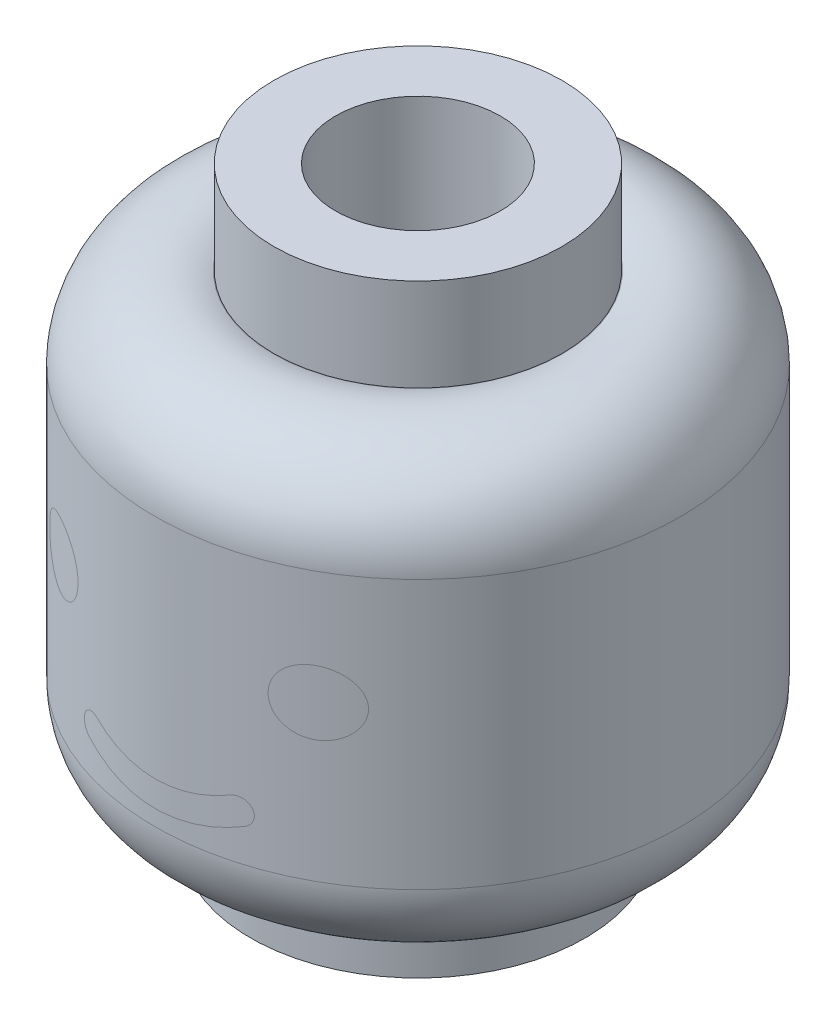
ISO-10303-21;
HEADER;
FILE_DESCRIPTION(('STEP AP214'),'2;1');
FILE_NAME('part.step','',(''),(''),'','','');
FILE_SCHEMA(('AUTOMOTIVE_DESIGN { 1 0 10303 214 1 1 1 1 }'));
ENDSEC;
DATA;
#1=APPLICATION_CONTEXT('core data for automotive mechanical design processes');
#2=APPLICATION_PROTOCOL_DEFINITION('international standard','automotive_design',2000,#1);
#3=PRODUCT_CONTEXT('',#1,'mechanical');
#4=PRODUCT('Part','Part','',(#3));
#5=PRODUCT_RELATED_PRODUCT_CATEGORY('part','',(#4));
#6=PRODUCT_DEFINITION_FORMATION('','',#4);
#7=PRODUCT_DEFINITION_CONTEXT('part definition',#1,'design');
#8=PRODUCT_DEFINITION('design','',#6,#7);
#9=PRODUCT_DEFINITION_SHAPE('','',#8);
#10=(LENGTH_UNIT() NAMED_UNIT(*) SI_UNIT(.MILLI.,.METRE.));
#11=(NAMED_UNIT(*) PLANE_ANGLE_UNIT() SI_UNIT($,.RADIAN.));
#12=(NAMED_UNIT(*) SI_UNIT($,.STERADIAN.) SOLID_ANGLE_UNIT());
#13=UNCERTAINTY_MEASURE_WITH_UNIT(LENGTH_MEASURE(1.E-05),#10,'distance_accuracy_value','');
#14=(GEOMETRIC_REPRESENTATION_CONTEXT(3) GLOBAL_UNCERTAINTY_ASSIGNED_CONTEXT((#13)) GLOBAL_UNIT_ASSIGNED_CONTEXT((#10,
#11,#12)) REPRESENTATION_CONTEXT('',''));
#15=CARTESIAN_POINT('',(0.,0.,0.));
#16=DIRECTION('',(0.,0.,1.));
#17=DIRECTION('',(1.,0.,0.));
#18=AXIS2_PLACEMENT_3D('',#15,#16,#17);
#19=CARTESIAN_POINT('',(0.,0.,0.));
#20=DIRECTION('',(0.,-1.,0.));
#21=DIRECTION('',(0.,0.,-1.));
#22=AXIS2_PLACEMENT_3D('',#19,#20,#21);
#23=CYLINDRICAL_SURFACE('',#22,5.1);
#24=CARTESIAN_POINT('',(1.29230769230769,4.25408109515948,4.93355255656635));
#25=CARTESIAN_POINT('',(1.22588861700081,4.22237068909749,4.95095914365787));
#26=CARTESIAN_POINT('',(1.15805426576758,4.1929999096417,4.96728590296533));
#27=CARTESIAN_POINT('',(1.01989445783117,4.1391801628546,4.99747898840957));
#28=CARTESIAN_POINT('',(0.949567849979218,4.11473350570831,5.01134415931557));
#29=CARTESIAN_POINT('',(0.806946973475218,4.07107180776308,5.03627524479221));
#30=CARTESIAN_POINT('',(0.734656246731726,4.05184795870389,5.04734587009735));
#31=CARTESIAN_POINT('',(0.588491034726496,4.01879837466652,5.06647048512419));
#32=CARTESIAN_POINT('',(0.514616830545434,4.00497168988103,5.07452500561787));
#33=CARTESIAN_POINT('',(0.290786918112003,3.97178825895375,5.09390065599043));
#34=CARTESIAN_POINT('',(0.139033730680463,3.9608543562066,5.10036060400772));
#35=CARTESIAN_POINT('',(-0.164334920099964,3.96213387289276,5.09960801603805));
#36=CARTESIAN_POINT('',(-0.315950389038478,3.97434630664532,5.09239606226549));
#37=CARTESIAN_POINT('',(-0.537331849244907,4.00906894357773,5.07213847664396));
#38=CARTESIAN_POINT('',(-0.609022976641743,4.02303209599416,5.064012679066));
#39=CARTESIAN_POINT('',(-0.750868622750052,4.05604320319779,5.04492865198251));
#40=CARTESIAN_POINT('',(-0.821022933784499,4.075091840679,5.03397004219623));
#41=CARTESIAN_POINT('',(-0.95943805765761,4.11809970831678,5.0094336969898));
#42=CARTESIAN_POINT('',(-1.02769609882792,4.14206573706987,4.99585233700146));
#43=CARTESIAN_POINT('',(-1.16184995911024,4.194646087782,4.96637071044));
#44=CARTESIAN_POINT('',(-1.22774673756994,4.22325849523477,4.95047139923637));
#45=CARTESIAN_POINT('',(-1.2923076923077,4.25408109515948,4.93355255656635));
#46=B_SPLINE_CURVE_WITH_KNOTS('',3,(#24,#25,#26,#27,#28,#29,#30,#31,#32,#33,#34,#35,#36,#37,#38,
#39,#40,#41,#42,#43,#44,#45),.UNSPECIFIED.,.F.,.F.,(4,2,2,2,2,2,2,2,2,2,4),(0.,
0.226855024268325,0.453816232457577,0.680392260630388,0.906928397356249,1.36128855000063,
1.81562935426994,2.03589216856599,2.2561845666244,2.4767836099487,2.697291986622),.UNSPECIFIED.);
#47=CARTESIAN_POINT('',(1.29230769230769,4.25408109515948,4.93355255656635));
#48=VERTEX_POINT('',#47);
#49=CARTESIAN_POINT('',(-1.29230769230769,4.25408109515948,4.93355255656635));
#50=VERTEX_POINT('',#49);
#51=EDGE_CURVE('E419',#48,#50,#46,.T.);
#52=ORIENTED_EDGE('',*,*,#51,.T.);
#53=CARTESIAN_POINT('',(-1.29230769230769,4.25408109515948,4.93355255656635));
#54=CARTESIAN_POINT('',(-1.30547581043881,4.26037822039603,4.93010579071235));
#55=CARTESIAN_POINT('',(-1.31915183921914,4.26547916200426,4.92646474923008));
#56=CARTESIAN_POINT('',(-1.34708624675953,4.27322759793367,4.9188983466482));
#57=CARTESIAN_POINT('',(-1.36134377179107,4.27587856278306,4.91497339625197));
#58=CARTESIAN_POINT('',(-1.39004433472992,4.27868384257217,4.90693392801757));
#59=CARTESIAN_POINT('',(-1.40448733222062,4.27883869250592,4.90281945099037));
#60=CARTESIAN_POINT('',(-1.43316537111265,4.27667269834466,4.89451320311304));
#61=CARTESIAN_POINT('',(-1.44740038106183,4.27435148366453,4.89032142078514));
#62=CARTESIAN_POINT('',(-1.47549454384824,4.26724127216415,4.88191912657831));
#63=CARTESIAN_POINT('',(-1.48934426446598,4.26241403793814,4.8777093569631));
#64=CARTESIAN_POINT('',(-1.51603731604597,4.25038813605253,4.86947903536574));
#65=CARTESIAN_POINT('',(-1.5288805409073,4.24318921879435,4.86545850335008));
#66=CARTESIAN_POINT('',(-1.55310868426944,4.22663667458158,4.85777873628787));
#67=CARTESIAN_POINT('',(-1.56450118210341,4.21729502671173,4.85411764845266));
#68=CARTESIAN_POINT('',(-1.5855404736624,4.19666669181486,4.84728624825094));
#69=CARTESIAN_POINT('',(-1.59518767499856,4.18538046014749,4.84411582131643));
#70=CARTESIAN_POINT('',(-1.61207593416043,4.16161385174445,4.83852122803878));
#71=CARTESIAN_POINT('',(-1.61939231837841,4.14919251889022,4.83607393971924));
#72=CARTESIAN_POINT('',(-1.63181270066259,4.1231777719944,4.83189719824589));
#73=CARTESIAN_POINT('',(-1.63691744863301,4.10958475711482,4.83016750178512));
#74=CARTESIAN_POINT('',(-1.64450910384696,4.08236124072317,4.8275879214484));
#75=CARTESIAN_POINT('',(-1.64711633024776,4.06876806537991,4.82669763698213));
#76=CARTESIAN_POINT('',(-1.65005099029977,4.04131055478364,4.82569520940822));
#77=CARTESIAN_POINT('',(-1.65037895663455,4.02744628364777,4.82558288448446));
#78=CARTESIAN_POINT('',(-1.64877055251492,4.00033056384696,4.82613263793194));
#79=CARTESIAN_POINT('',(-1.64690908206269,3.98707406298683,4.82676910067593));
#80=CARTESIAN_POINT('',(-1.64111461427287,3.96107806512553,4.82874228779956));
#81=CARTESIAN_POINT('',(-1.63718173609501,3.94833853843033,4.83007897189828));
#82=CARTESIAN_POINT('',(-1.62735714430615,3.92365034868767,4.83339793329887));
#83=CARTESIAN_POINT('',(-1.62145500029158,3.91170631198636,4.8353836470812));
#84=CARTESIAN_POINT('',(-1.60788974919105,3.88897672565596,4.83991130908473));
#85=CARTESIAN_POINT('',(-1.60022584652041,3.87819170265952,4.84245350858198));
#86=CARTESIAN_POINT('',(-1.5830338897801,3.8576284661279,4.84810156183211));
#87=CARTESIAN_POINT('',(-1.57344402263644,3.84790705103213,4.85122575286047));
#88=CARTESIAN_POINT('',(-1.55289999584501,3.83021069443434,4.85784078726189));
#89=CARTESIAN_POINT('',(-1.54194736011672,3.82223382913897,4.86133122041112));
#90=CARTESIAN_POINT('',(-1.52307834801866,3.81068789177738,4.86726756952062));
#91=CARTESIAN_POINT('',(-1.51547539128563,3.80656227496335,4.86964108354754));
#92=CARTESIAN_POINT('',(-1.50769230769231,3.80285003743448,4.87204925111861));
#93=B_SPLINE_CURVE_WITH_KNOTS('',3,(#53,#54,#55,#56,#57,#58,#59,#60,#61,#62,#63,#64,#65,#66,#67,
#68,#69,#70,#71,#72,#73,#74,#75,#76,#77,#78,#79,#80,#81,#82,#83,#84,#85,#86,#87,#88,#89,#90,#91,
#92),.UNSPECIFIED.,.F.,.F.,(4,2,2,2,2,2,2,2,2,2,2,2,2,2,2,2,2,2,2,4),(0.,0.0449214831244463,
0.0897792344966947,0.134627371348438,0.179482221427759,0.225042517255217,0.270607609431843,
0.31592392113096,0.361229635578571,0.404872239555663,0.448500033938543,0.489901006361838,
0.5312923026801,0.571307829525004,0.611321054689821,0.651549670089935,0.691796487962446,
0.733637428926001,0.77543199471816,0.802293138858672),.UNSPECIFIED.);
#94=CARTESIAN_POINT('',(-1.50769230769231,3.80285003743448,4.87204925111861));
#95=VERTEX_POINT('',#94);
#96=EDGE_CURVE('E11',#50,#95,#93,.T.);
#97=ORIENTED_EDGE('',*,*,#96,.T.);
#98=CARTESIAN_POINT('',(-1.50769230769231,3.80285003743448,4.87204925111861));
#99=CARTESIAN_POINT('',(-1.43370919433084,3.76752766724665,4.89495407410749));
#100=CARTESIAN_POINT('',(-1.35811386347073,3.73464407510017,4.91649100065942));
#101=CARTESIAN_POINT('',(-1.2040363960122,3.67404595251743,4.95647137250403));
#102=CARTESIAN_POINT('',(-1.12555260718714,3.6463344373561,4.97491301264523));
#103=CARTESIAN_POINT('',(-0.966045149993209,3.59638945852869,5.00833389598757));
#104=CARTESIAN_POINT('',(-0.885019083900304,3.57416135292011,5.02330975175607));
#105=CARTESIAN_POINT('',(-0.721007429883763,3.53550127383854,5.04945942252728));
#106=CARTESIAN_POINT('',(-0.638022244406144,3.51906812082097,5.06063401124969));
#107=CARTESIAN_POINT('',(-0.470341938526448,3.49217167910401,5.0789679987167));
#108=CARTESIAN_POINT('',(-0.38564180037211,3.48172975417409,5.08611302716088));
#109=CARTESIAN_POINT('',(-0.215422701344382,3.46705848094945,5.09616183980381));
#110=CARTESIAN_POINT('',(-0.129903451362183,3.46283141415117,5.09906406645278));
#111=CARTESIAN_POINT('',(0.0411401584996869,3.46066626991437,5.10054970587997));
#112=CARTESIAN_POINT('',(0.126664351466687,3.46271960021197,5.09913901919221));
#113=CARTESIAN_POINT('',(0.297167137913866,3.47305800122003,5.09205163156697));
#114=CARTESIAN_POINT('',(0.38214553075717,3.48134524455799,5.08637344333132));
#115=CARTESIAN_POINT('',(0.627524327727556,3.51436243666345,5.06381849287626));
#116=CARTESIAN_POINT('',(0.786420138809055,3.54718851571326,5.04145572327317));
#117=CARTESIAN_POINT('',(1.09567577625644,3.63351269308262,4.98339913410561));
#118=CARTESIAN_POINT('',(1.24604317690775,3.68699210821585,4.94771736399732));
#119=CARTESIAN_POINT('',(1.43015590623536,3.76670416396321,4.8955445408912));
#120=CARTESIAN_POINT('',(1.46914933543684,3.78444879185921,4.88398074723492));
#121=CARTESIAN_POINT('',(1.50769230769231,3.80285003743448,4.87204925111861));
#122=B_SPLINE_CURVE_WITH_KNOTS('',3,(#98,#99,#100,#101,#102,#103,#104,#105,#106,#107,#108,#109,
#110,#111,#112,#113,#114,#115,#116,#117,#118,#119,#120,#121),.UNSPECIFIED.,.F.,.F.,(4,2,2,2,2,2,
2,2,2,2,2,4),(0.,0.255337881999677,0.510824161884533,0.766559107420016,1.02224196881486,
1.27883097745243,1.53551415732444,1.79184632393748,2.04826786819921,2.53727993089788,
3.02585066134497,3.1589308623366),.UNSPECIFIED.);
#123=CARTESIAN_POINT('',(1.50769230769231,3.80285003743448,4.87204925111861));
#124=VERTEX_POINT('',#123);
#125=EDGE_CURVE('E57',#95,#124,#122,.T.);
#126=ORIENTED_EDGE('',*,*,#125,.T.);
#127=CARTESIAN_POINT('',(1.50769230769231,3.80285003743448,4.87204925111861));
#128=CARTESIAN_POINT('',(1.52043967292614,3.80892389207107,4.8681058314694));
#129=CARTESIAN_POINT('',(1.53269286417562,3.81610883748213,4.8642577897413));
#130=CARTESIAN_POINT('',(1.55589250859926,3.83251055230162,4.85688619617928));
#131=CARTESIAN_POINT('',(1.56683698219197,3.84173034116596,4.85336313771352));
#132=CARTESIAN_POINT('',(1.58707582301318,3.86200717943883,4.84678294474081));
#133=CARTESIAN_POINT('',(1.59636769813775,3.87306695573448,4.84372651487204));
#134=CARTESIAN_POINT('',(1.61295657674623,3.89671676085328,4.83822771457206));
#135=CARTESIAN_POINT('',(1.62025545628484,3.90930533433959,4.83578476683059));
#136=CARTESIAN_POINT('',(1.63236860273475,3.93518349165622,4.83170905341994));
#137=CARTESIAN_POINT('',(1.63726298223319,3.94843142096439,4.83005024650083));
#138=CARTESIAN_POINT('',(1.6447606581698,3.97563432824058,4.82750228114942));
#139=CARTESIAN_POINT('',(1.64736403867611,3.98958928024455,4.82661309447597));
#140=CARTESIAN_POINT('',(1.65010793974114,4.017121949213,4.8256756786411));
#141=CARTESIAN_POINT('',(1.65035529915925,4.03068787252163,4.82559096925891));
#142=CARTESIAN_POINT('',(1.64865652144264,4.0576630456147,4.82617161631263));
#143=CARTESIAN_POINT('',(1.64671082263277,4.07107232616607,4.82683682286343));
#144=CARTESIAN_POINT('',(1.64074370899042,4.09716071392666,4.82886836678685));
#145=CARTESIAN_POINT('',(1.63675224919799,4.10984750007835,4.83022458439052));
#146=CARTESIAN_POINT('',(1.62685101576418,4.13435886507319,4.83356834226028));
#147=CARTESIAN_POINT('',(1.62094102115567,4.146183344408,4.83555595524672));
#148=CARTESIAN_POINT('',(1.60722465311738,4.16896138773502,4.8401324647687));
#149=CARTESIAN_POINT('',(1.59937464601847,4.17988586344237,4.84273512540892));
#150=CARTESIAN_POINT('',(1.58210220160994,4.20027183793719,4.84840541985248));
#151=CARTESIAN_POINT('',(1.57267943112406,4.20973302591995,4.85147315216454));
#152=CARTESIAN_POINT('',(1.55204167920406,4.22740410116025,4.85811583063157));
#153=CARTESIAN_POINT('',(1.54076259669134,4.23553264856702,4.86170800342955));
#154=CARTESIAN_POINT('',(1.51708078753349,4.24978708010406,4.86914981269255));
#155=CARTESIAN_POINT('',(1.50467785384334,4.25591259425731,4.87299949656403));
#156=CARTESIAN_POINT('',(1.47850882396093,4.26625288715066,4.88100468466191));
#157=CARTESIAN_POINT('',(1.46470682808761,4.2703723350471,4.88516619984672));
#158=CARTESIAN_POINT('',(1.4365999887401,4.27618817667935,4.89350542540881));
#159=CARTESIAN_POINT('',(1.42229491773682,4.27788345919789,4.89768314233359));
#160=CARTESIAN_POINT('',(1.39329369908337,4.2788046912398,4.90601314199094));
#161=CARTESIAN_POINT('',(1.37859536944953,4.27798177578482,4.91016333509879));
#162=CARTESIAN_POINT('',(1.34952943734206,4.2737563481854,4.91823099172259));
#163=CARTESIAN_POINT('',(1.33516133924489,4.27035800273855,4.92214882014501));
#164=CARTESIAN_POINT('',(1.31133726767922,4.26244677526675,4.92853951469861));
#165=CARTESIAN_POINT('',(1.30169035471946,4.25856516454122,4.93109580905959));
#166=CARTESIAN_POINT('',(1.29230769230769,4.25408109515948,4.93355255656635));
#167=B_SPLINE_CURVE_WITH_KNOTS('',3,(#127,#128,#129,#130,#131,#132,#133,#134,#135,#136,#137,
#138,#139,#140,#141,#142,#143,#144,#145,#146,#147,#148,#149,#150,#151,#152,#153,#154,#155,#156,
#157,#158,#159,#160,#161,#162,#163,#164,#165,#166),.UNSPECIFIED.,.F.,.F.,(4,2,2,2,2,2,2,2,2,2,2,
2,2,2,2,2,2,2,2,4),(0.,0.04394169445748,0.0879490366681004,0.132022189043521,0.176053710146528,
0.21849726659161,0.260939265506971,0.301446942698854,0.341946525088201,0.381869349720327,
0.42179677409338,0.462720337939842,0.503652582116524,0.546539685540569,0.589434706102915,
0.634206586345367,0.67899898307402,0.724666039085702,0.770259369283766,0.802304361634527),.UNSPECIFIED.);
#168=EDGE_CURVE('E425',#124,#48,#167,.T.);
#169=ORIENTED_EDGE('',*,*,#168,.T.);
#170=EDGE_LOOP('',(#52,#97,#126,#169));
#171=FACE_BOUND('',#170,.T.);
#172=ADVANCED_FACE('F42',(#171),#23,.T.);
#173=CARTESIAN_POINT('',(3.095,6.16146744150947,4.0535139077102));
#174=CARTESIAN_POINT('',(3.09499860193585,6.19172799450688,4.05351520990944));
#175=CARTESIAN_POINT('',(3.09278766178486,6.22199988996722,4.05520602983803));
#176=CARTESIAN_POINT('',(3.08409267226761,6.28156456534221,4.0618223283753));
#177=CARTESIAN_POINT('',(3.07760525295517,6.31085655392842,4.06675035795551));
#178=CARTESIAN_POINT('',(3.06080334550029,6.36748914449043,4.07941069466848));
#179=CARTESIAN_POINT('',(3.05050880681332,6.39483904800461,4.08712837921838));
#180=CARTESIAN_POINT('',(3.02659584988562,6.44722298734285,4.10486765296008));
#181=CARTESIAN_POINT('',(3.01297657074637,6.47225642102801,4.11488983883357));
#182=CARTESIAN_POINT('',(2.98163294767719,6.5217258246024,4.13766486035557));
#183=CARTESIAN_POINT('',(2.96365703173191,6.54592730015925,4.15057798734039));
#184=CARTESIAN_POINT('',(2.92495832811053,6.59102779149593,4.17793983665437));
#185=CARTESIAN_POINT('',(2.9042342616573,6.61192525986055,4.19238927323921));
#186=CARTESIAN_POINT('',(2.85620082544248,6.65409979122303,4.22529532660076));
#187=CARTESIAN_POINT('',(2.82839881449989,6.67463872406835,4.24398018116912));
#188=CARTESIAN_POINT('',(2.77022658703614,6.71070501737419,4.28217918969877));
#189=CARTESIAN_POINT('',(2.739854509567,6.72622870649971,4.30169393940038));
#190=CARTESIAN_POINT('',(2.67243169046927,6.75406153257456,4.34395165708201));
#191=CARTESIAN_POINT('',(2.63506267930364,6.76553869173234,4.3667396050707));
#192=CARTESIAN_POINT('',(2.55862354696581,6.78138283301316,4.41196322532));
#193=CARTESIAN_POINT('',(2.51955276207472,6.7857470150001,4.43439875540534));
#194=CARTESIAN_POINT('',(2.4392707814489,6.78704692905129,4.47907820666036));
#195=CARTESIAN_POINT('',(2.3980335025884,6.78370581943564,4.50128527055906));
#196=CARTESIAN_POINT('',(2.31616559816084,6.76866550209722,4.54395252845122));
#197=CARTESIAN_POINT('',(2.27553473276848,6.75696969300245,4.564413428983));
#198=CARTESIAN_POINT('',(2.19940954765823,6.72623792076884,4.60154988307877));
#199=CARTESIAN_POINT('',(2.16375676573105,6.70779993076919,4.61839271449916));
#200=CARTESIAN_POINT('',(2.09592297204455,6.66378377215512,4.6495697657722));
#201=CARTESIAN_POINT('',(2.06373906836366,6.63821161596357,4.66390608154946));
#202=CARTESIAN_POINT('',(2.00782280643255,6.58379872883863,4.68822715267566));
#203=CARTESIAN_POINT('',(1.98354629633834,6.55565452025639,4.6985206527866));
#204=CARTESIAN_POINT('',(1.94010086196038,6.49496635574877,4.71662634450064));
#205=CARTESIAN_POINT('',(1.9209288069266,6.46242511523586,4.72444005761565));
#206=CARTESIAN_POINT('',(1.89009195435159,6.39708899556223,4.73685599133932));
#207=CARTESIAN_POINT('',(1.87790556056775,6.36458239684479,4.74168450559473));
#208=CARTESIAN_POINT('',(1.85905654473972,6.29776348306021,4.74910651657552));
#209=CARTESIAN_POINT('',(1.85239206114323,6.26345178068347,4.75170076653013));
#210=CARTESIAN_POINT('',(1.84506116193845,6.19579265069876,4.75455189833201));
#211=CARTESIAN_POINT('',(1.84411930354593,6.16247925962172,4.75491612322934));
#212=CARTESIAN_POINT('',(1.8475348885831,6.09616920119354,4.75359003329659));
#213=CARTESIAN_POINT('',(1.8518916575595,6.06317249407103,4.75189997995212));
#214=CARTESIAN_POINT('',(1.86564259871342,5.99884542527523,4.74651773484516));
#215=CARTESIAN_POINT('',(1.87497451161927,5.96749961958088,4.74285028209161));
#216=CARTESIAN_POINT('',(1.89827394433829,5.90689225046587,4.73357288763884));
#217=CARTESIAN_POINT('',(1.9122416015323,5.87763074884502,4.7279628883718));
#218=CARTESIAN_POINT('',(1.94459925360048,5.82139176737223,4.7147474575013));
#219=CARTESIAN_POINT('',(1.96306837257127,5.79446837131119,4.70710607285697));
#220=CARTESIAN_POINT('',(2.00360948770874,5.7441553409494,4.68999277485843));
#221=CARTESIAN_POINT('',(2.02568209851579,5.72076631081119,4.68052054917055));
#222=CARTESIAN_POINT('',(2.07388815582137,5.67686838639518,4.65936838278014));
#223=CARTESIAN_POINT('',(2.10017090727434,5.65656609221363,4.64760075102104));
#224=CARTESIAN_POINT('',(2.15503335901651,5.62063708341674,4.62241740714542));
#225=CARTESIAN_POINT('',(2.18361376667129,5.60501181573625,4.60900118681087));
#226=CARTESIAN_POINT('',(2.24467717791531,5.57745786741589,4.57959207992872));
#227=CARTESIAN_POINT('',(2.27728747840728,5.56594159319007,4.56347787002957));
#228=CARTESIAN_POINT('',(2.3433079341888,5.54848978927312,4.52993172346121));
#229=CARTESIAN_POINT('',(2.37671842702197,5.54255665879281,4.51249922376442));
#230=CARTESIAN_POINT('',(2.44701857025755,5.5357919294469,4.47480161963922));
#231=CARTESIAN_POINT('',(2.48390866670006,5.53555509630338,4.45443047845522));
#232=CARTESIAN_POINT('',(2.55678538677833,5.54144210411704,4.41300452057061));
#233=CARTESIAN_POINT('',(2.59277162760133,5.54756859513224,4.39194942256952));
#234=CARTESIAN_POINT('',(2.6662715936861,5.56676280365719,4.34775754752757));
#235=CARTESIAN_POINT('',(2.70362575043334,5.58041209711564,4.32460589287634));
#236=CARTESIAN_POINT('',(2.77542179929066,5.61472504631483,4.27888397771699));
#237=CARTESIAN_POINT('',(2.80986077083904,5.63539563478928,4.25631431564991));
#238=CARTESIAN_POINT('',(2.87521235954335,5.68386282949409,4.21244850739158));
#239=CARTESIAN_POINT('',(2.90607217390348,5.7117502745022,4.19117321133667));
#240=CARTESIAN_POINT('',(2.96238699485579,5.77424756742899,4.15155937417582));
#241=CARTESIAN_POINT('',(2.98785473518364,5.80884119926362,4.13321393978616));
#242=CARTESIAN_POINT('',(3.02464224828533,5.87187274649563,4.10632208099495));
#243=CARTESIAN_POINT('',(3.03787229533079,5.89867246949772,4.0965267546273));
#244=CARTESIAN_POINT('',(3.0605420992893,5.95460711097047,4.0796179282492));
#245=CARTESIAN_POINT('',(3.06998826793891,5.98373797796078,4.07249989286133));
#246=CARTESIAN_POINT('',(3.08309706894776,6.03759779307777,4.06258118535075));
#247=CARTESIAN_POINT('',(3.08754141143147,6.06203145638561,4.05919967300131));
#248=CARTESIAN_POINT('',(3.09349349891351,6.11146330051295,4.05466546251341));
#249=CARTESIAN_POINT('',(3.09500115529656,6.13646149834441,4.05351283163204));
#250=CARTESIAN_POINT('',(3.095,6.16146744150947,4.0535139077102));
#251=B_SPLINE_CURVE_WITH_KNOTS('',3,(#173,#174,#175,#176,#177,#178,#179,#180,#181,#182,#183,
#184,#185,#186,#187,#188,#189,#190,#191,#192,#193,#194,#195,#196,#197,#198,#199,#200,#201,#202,
#203,#204,#205,#206,#207,#208,#209,#210,#211,#212,#213,#214,#215,#216,#217,#218,#219,#220,#221,
#222,#223,#224,#225,#226,#227,#228,#229,#230,#231,#232,#233,#234,#235,#236,#237,#238,#239,#240,
#241,#242,#243,#244,#245,#246,#247,#248,#249,#250),.UNSPECIFIED.,.T.,.F.,(4,2,2,2,2,2,2,2,2,2,2,
2,2,2,2,2,2,2,2,2,2,2,2,2,2,2,2,2,2,2,2,2,2,2,2,2,2,2,4),(0.,0.0906787627947074,
0.181429067721731,0.271710424098317,0.36201518250626,0.460048594000146,0.558127783807477,
0.675552291108697,0.793062563530542,0.928207018511045,1.0634046624073,1.20353508450097,
1.34360853504654,1.47345948899792,1.60320133803533,1.7182731462541,1.83327421325887,
1.9378900710966,2.04247064635766,2.14197490073356,2.241466490707,2.33974129513164,
2.43801901220197,2.53816759256269,2.63833327294725,2.74358604597446,2.84887134754808,
2.96286094284713,3.07689949987094,3.20279867331579,3.32875029952491,3.4661777460219,
3.60374128291714,3.74312854094349,3.88218286175426,3.97617380616965,4.0700048034043,
4.14493534315316,4.21986814391581),.UNSPECIFIED.);
#252=CARTESIAN_POINT('',(3.095,6.16146744150947,4.0535139077102));
#253=VERTEX_POINT('',#252);
#254=EDGE_CURVE('E286',#253,#253,#251,.T.);
#255=ORIENTED_EDGE('',*,*,#254,.T.);
#256=EDGE_LOOP('',(#255));
#257=FACE_BOUND('',#256,.T.);
#258=ADVANCED_FACE('F365',(#257),#23,.T.);
#259=CARTESIAN_POINT('',(-1.845,6.16146744150947,4.75457411341962));
#260=CARTESIAN_POINT('',(-1.84499920350535,6.19469052715655,4.75457430406465));
#261=CARTESIAN_POINT('',(-1.84765745197126,6.22790833654837,4.7535454255577));
#262=CARTESIAN_POINT('',(-1.85817944941604,6.29337332910446,4.74944215005716));
#263=CARTESIAN_POINT('',(-1.86604227741473,6.3256206829411,4.74636811496525));
#264=CARTESIAN_POINT('',(-1.88664902018034,6.3882081059728,4.7382145341163));
#265=CARTESIAN_POINT('',(-1.89938834187857,6.4185499387294,4.7331368753926));
#266=CARTESIAN_POINT('',(-1.92925604716883,6.47656385517422,4.72104115046017));
#267=CARTESIAN_POINT('',(-1.94638479583096,6.50423571653641,4.71402292284984));
#268=CARTESIAN_POINT('',(-1.98480643471912,6.55680846086866,4.69797663281727));
#269=CARTESIAN_POINT('',(-2.00617959699848,6.581638516849,4.68890927025737));
#270=CARTESIAN_POINT('',(-2.05209341399138,6.62733108173221,4.66899755599778));
#271=CARTESIAN_POINT('',(-2.07663468338846,6.64819281874457,4.65815285934522));
#272=CARTESIAN_POINT('',(-2.12971385871981,6.68679911352754,4.63413613951042));
#273=CARTESIAN_POINT('',(-2.15840568668008,6.70426737753367,4.62086102409777));
#274=CARTESIAN_POINT('',(-2.21757981665435,6.73418875070092,4.59275666253795));
#275=CARTESIAN_POINT('',(-2.24806277153514,6.74664001800654,4.57792684813813));
#276=CARTESIAN_POINT('',(-2.31285861824305,6.7674322923299,4.54555965109184));
#277=CARTESIAN_POINT('',(-2.34726529958598,6.77528777316398,4.5278986997305));
#278=CARTESIAN_POINT('',(-2.4163055058728,6.78513357061616,4.49143570938817));
#279=CARTESIAN_POINT('',(-2.45093911465559,6.78712158091,4.47263322466797));
#280=CARTESIAN_POINT('',(-2.52325916921179,6.78535058613148,4.43227373534371));
#281=CARTESIAN_POINT('',(-2.56088490612101,6.78096707298784,4.41063463996238));
#282=CARTESIAN_POINT('',(-2.63457975318231,6.76558450257911,4.36701578478511));
#283=CARTESIAN_POINT('',(-2.67064760647881,6.75458020689292,4.34503576867941));
#284=CARTESIAN_POINT('',(-2.74295186748084,6.7251654613148,4.29978635465344));
#285=CARTESIAN_POINT('',(-2.77900785672802,6.70627241598778,4.27654015828697));
#286=CARTESIAN_POINT('',(-2.84733166068423,6.66138160164918,4.23135638780459));
#287=CARTESIAN_POINT('',(-2.87960210218252,6.63538880134026,4.20941791152427));
#288=CARTESIAN_POINT('',(-2.93268717134774,6.58291921234826,4.17254799257693));
#289=CARTESIAN_POINT('',(-2.95446987197282,6.55776331711742,4.15712735978474));
#290=CARTESIAN_POINT('',(-2.99421695880275,6.50344718261535,4.12859077400189));
#291=CARTESIAN_POINT('',(-3.01218660388553,6.47429255094653,4.11547165120855));
#292=CARTESIAN_POINT('',(-3.0409034903585,6.41746763850714,4.09428532299961));
#293=CARTESIAN_POINT('',(-3.05235046496813,6.39032953004754,4.08574326423624));
#294=CARTESIAN_POINT('',(-3.07143318348613,6.33404809569067,4.07141762829974));
#295=CARTESIAN_POINT('',(-3.07907113905306,6.30490594462774,4.06563245046557));
#296=CARTESIAN_POINT('',(-3.09010947772414,6.24521834624068,4.05724946012816));
#297=CARTESIAN_POINT('',(-3.09348879207714,6.21466669106443,4.05466749583518));
#298=CARTESIAN_POINT('',(-3.09569963467274,6.15330456464067,4.05297992234742));
#299=CARTESIAN_POINT('',(-3.09453227476647,6.12249415850727,4.05387346324686));
#300=CARTESIAN_POINT('',(-3.08802567175795,6.06422028012998,4.05883124428674));
#301=CARTESIAN_POINT('',(-3.08304283395885,6.03669212132631,4.06262456648456));
#302=CARTESIAN_POINT('',(-3.06961591270729,5.98299572657177,4.07277894827268));
#303=CARTESIAN_POINT('',(-3.06117119267949,5.95682774172915,4.07914048010538));
#304=CARTESIAN_POINT('',(-3.04069350634257,5.90505133087674,4.09442957878904));
#305=CARTESIAN_POINT('',(-3.02849675209748,5.87954280090619,4.10347340152777));
#306=CARTESIAN_POINT('',(-3.00119582895741,5.83096242921478,4.12348274141375));
#307=CARTESIAN_POINT('',(-2.98609033819963,5.807891702754,4.13444913206001));
#308=CARTESIAN_POINT('',(-2.95070954185588,5.76078173279986,4.15979090755149));
#309=CARTESIAN_POINT('',(-2.92999230215707,5.73721709790755,4.17443000782861));
#310=CARTESIAN_POINT('',(-2.88582877191806,5.69384478519461,4.20508222358603));
#311=CARTESIAN_POINT('',(-2.86238068216117,5.67403960714016,4.22109624308335));
#312=CARTESIAN_POINT('',(-2.80858923836408,5.63488537036958,4.25711881931157));
#313=CARTESIAN_POINT('',(-2.77778215172349,5.61633751153106,4.2773083445416));
#314=CARTESIAN_POINT('',(-2.71374426873498,5.58484935647124,4.31822174831926));
#315=CARTESIAN_POINT('',(-2.68051192130769,5.57191268626893,4.33894596325404));
#316=CARTESIAN_POINT('',(-2.60813242880629,5.55061989010153,4.38288088828667));
#317=CARTESIAN_POINT('',(-2.56875826416209,5.54301498289659,4.40608654373895));
#318=CARTESIAN_POINT('',(-2.48882428826254,5.53546245065263,4.45172688427581));
#319=CARTESIAN_POINT('',(-2.44826422911635,5.5355164381814,4.47416140600486));
#320=CARTESIAN_POINT('',(-2.36715265082265,5.54364232100314,4.51759928211651));
#321=CARTESIAN_POINT('',(-2.32660113155463,5.551714094338,4.53860265826299));
#322=CARTESIAN_POINT('',(-2.24698327012814,5.57613099548558,4.57854194541311));
#323=CARTESIAN_POINT('',(-2.20791601521389,5.59247094721686,4.59747914089103));
#324=CARTESIAN_POINT('',(-2.13649451888951,5.63146949664629,4.63106954949723));
#325=CARTESIAN_POINT('',(-2.10385383669216,5.65339952972906,4.64595735309994));
#326=CARTESIAN_POINT('',(-2.04268538693218,5.70365751294205,4.67317417679004));
#327=CARTESIAN_POINT('',(-2.01415420983071,5.7319801086717,4.6855053218409));
#328=CARTESIAN_POINT('',(-1.96552275174193,5.79076766008387,4.70609624318402));
#329=CARTESIAN_POINT('',(-1.94483793675522,5.82064489586054,4.71465616030132));
#330=CARTESIAN_POINT('',(-1.90878827661837,5.88399232653877,4.72936655302359));
#331=CARTESIAN_POINT('',(-1.89342141667525,5.91746115439777,4.73551794125487));
#332=CARTESIAN_POINT('',(-1.86923845718362,5.98550664312903,4.74511446619856));
#333=CARTESIAN_POINT('',(-1.86018381238167,6.01998465488506,4.74865846920509));
#334=CARTESIAN_POINT('',(-1.84806584661198,6.09013317517936,4.75338786164922));
#335=CARTESIAN_POINT('',(-1.84500085501568,6.12580334837702,4.75457390876729));
#336=CARTESIAN_POINT('',(-1.845,6.16146744150947,4.75457411341962));
#337=B_SPLINE_CURVE_WITH_KNOTS('',3,(#259,#260,#261,#262,#263,#264,#265,#266,#267,#268,#269,
#270,#271,#272,#273,#274,#275,#276,#277,#278,#279,#280,#281,#282,#283,#284,#285,#286,#287,#288,
#289,#290,#291,#292,#293,#294,#295,#296,#297,#298,#299,#300,#301,#302,#303,#304,#305,#306,#307,
#308,#309,#310,#311,#312,#313,#314,#315,#316,#317,#318,#319,#320,#321,#322,#323,#324,#325,#326,
#327,#328,#329,#330,#331,#332,#333,#334,#335,#336),.UNSPECIFIED.,.T.,.F.,(4,2,2,2,2,2,2,2,2,2,2,
2,2,2,2,2,2,2,2,2,2,2,2,2,2,2,2,2,2,2,2,2,2,2,2,2,2,2,4),(0.,0.0995396134183582,
0.199061617438708,0.298490113473083,0.397926881693869,0.499462764286354,0.601018376800005,
0.708920840821429,0.816862882318314,0.934769207151073,1.05272187120697,1.18304336994216,
1.3134681160352,1.45342709615701,1.59328837704528,1.70289628355717,1.81235202446057,
1.9039731398253,1.9955409944317,2.08756010614522,2.17955671676834,2.26387342363708,
2.34820564172932,2.43692418242666,2.52568313644157,2.62917137321433,2.73272818294955,
2.85595521069489,2.97926175104852,3.11760918654601,3.25598575091373,3.39436021047522,
3.53264815122218,3.65808113191996,3.78340943749031,3.89481210487365,4.00617251923513,
4.11305544572557,4.21990855627139),.UNSPECIFIED.);
#338=CARTESIAN_POINT('',(-1.845,6.16146744150947,4.75457411341962));
#339=VERTEX_POINT('',#338);
#340=EDGE_CURVE('E278',#339,#339,#337,.T.);
#341=ORIENTED_EDGE('',*,*,#340,.T.);
#342=EDGE_LOOP('',(#341));
#343=FACE_BOUND('',#342,.T.);
#344=ADVANCED_FACE('F303',(#343),#23,.T.);
#345=CARTESIAN_POINT('',(0.,9.76146744150947,0.));
#346=DIRECTION('',(0.,1.,0.));
#347=DIRECTION('',(0.,0.,1.));
#348=AXIS2_PLACEMENT_3D('',#345,#346,#347);
#349=PLANE('',#348);
#350=DIRECTION('',(0.866025403784436,0.,-0.500000000000004));
#351=VECTOR('',#350,1.);
#352=CARTESIAN_POINT('',(0.210000000000002,9.76146744150947,0.363730669589463));
#353=LINE('',#352,#351);
#354=CARTESIAN_POINT('',(-1.12704898937922,9.76146744150947,1.13567626352728));
#355=VERTEX_POINT('',#354);
#356=CARTESIAN_POINT('',(0.,9.76146744150947,0.484974226119286));
#357=VERTEX_POINT('',#356);
#358=EDGE_CURVE('E130',#355,#357,#353,.T.);
#359=ORIENTED_EDGE('',*,*,#358,.T.);
#360=DIRECTION('',(0.86602540378444,0.,0.499999999999998));
#361=VECTOR('',#360,1.);
#362=CARTESIAN_POINT('',(-0.209999999999999,9.76146744150947,0.363730669589465));
#363=LINE('',#362,#361);
#364=CARTESIAN_POINT('',(1.12704898937923,9.76146744150947,1.13567626352727));
#365=VERTEX_POINT('',#364);
#366=EDGE_CURVE('E140',#357,#365,#363,.T.);
#367=ORIENTED_EDGE('',*,*,#366,.T.);
#368=CARTESIAN_POINT('',(0.,9.76146744150947,0.));
#369=DIRECTION('',(0.,-1.,0.));
#370=DIRECTION('',(0.,0.,-1.));
#371=AXIS2_PLACEMENT_3D('',#368,#369,#370);
#372=CIRCLE('',#371,1.6);
#373=CARTESIAN_POINT('',(1.54704898937923,9.76146744150947,0.408214924348333));
#374=VERTEX_POINT('',#373);
#375=EDGE_CURVE('E258',#374,#365,#372,.T.);
#376=ORIENTED_EDGE('',*,*,#375,.F.);
#377=DIRECTION('',(-0.866025403784443,0.,-0.499999999999992));
#378=VECTOR('',#377,1.);
#379=CARTESIAN_POINT('',(0.209999999999997,9.76146744150947,-0.363730669589466));
#380=LINE('',#379,#378);
#381=CARTESIAN_POINT('',(0.419999999999998,9.76146744150947,-0.242487113059646));
#382=VERTEX_POINT('',#381);
#383=EDGE_CURVE('E166',#374,#382,#380,.T.);
#384=ORIENTED_EDGE('',*,*,#383,.T.);
#385=DIRECTION('',(0.,0.,-1.));
#386=VECTOR('',#385,1.);
#387=CARTESIAN_POINT('',(0.42,9.76146744150947,0.));
#388=LINE('',#387,#386);
#389=CARTESIAN_POINT('',(0.419999999999989,9.76146744150947,-1.54389118787563));
#390=VERTEX_POINT('',#389);
#391=EDGE_CURVE('E162',#382,#390,#388,.T.);
#392=ORIENTED_EDGE('',*,*,#391,.T.);
#393=CARTESIAN_POINT('',(-0.42,9.76146744150947,-1.54389118787562));
#394=VERTEX_POINT('',#393);
#395=EDGE_CURVE('E253',#394,#390,#372,.T.);
#396=ORIENTED_EDGE('',*,*,#395,.F.);
#397=DIRECTION('',(0.,0.,1.));
#398=VECTOR('',#397,1.);
#399=CARTESIAN_POINT('',(-0.42,9.76146744150947,0.));
#400=LINE('',#399,#398);
#401=CARTESIAN_POINT('',(-0.42,9.76146744150947,-0.242487113059643));
#402=VERTEX_POINT('',#401);
#403=EDGE_CURVE('E194',#394,#402,#400,.T.);
#404=ORIENTED_EDGE('',*,*,#403,.T.);
#405=DIRECTION('',(-0.86602540378444,0.,0.499999999999998));
#406=VECTOR('',#405,1.);
#407=CARTESIAN_POINT('',(-0.209999999999999,9.76146744150947,-0.363730669589465));
#408=LINE('',#407,#406);
#409=CARTESIAN_POINT('',(-1.54704898937922,9.76146744150947,0.408214924348343));
#410=VERTEX_POINT('',#409);
#411=EDGE_CURVE('E191',#402,#410,#408,.T.);
#412=ORIENTED_EDGE('',*,*,#411,.T.);
#413=EDGE_CURVE('E153',#355,#410,#372,.T.);
#414=ORIENTED_EDGE('',*,*,#413,.F.);
#415=EDGE_LOOP('',(#359,#367,#376,#384,#392,#396,#404,#412,#414));
#416=FACE_BOUND('',#415,.T.);
#417=ADVANCED_FACE('F151',(#416),#349,.T.);
#418=CARTESIAN_POINT('',(2.45,8.86146744150947,0.));
#419=DIRECTION('',(0.,-1.,0.));
#420=DIRECTION('',(0.,0.,-1.));
#421=AXIS2_PLACEMENT_3D('',#418,#419,#420);
#422=PLANE('',#421);
#423=CARTESIAN_POINT('',(0.,8.86146744150947,0.));
#424=DIRECTION('',(0.,-1.,0.));
#425=DIRECTION('',(0.,0.,-1.));
#426=AXIS2_PLACEMENT_3D('',#423,#424,#425);
#427=CIRCLE('',#426,2.45);
#428=CARTESIAN_POINT('',(0.,8.86146744150947,-2.45));
#429=VERTEX_POINT('',#428);
#430=EDGE_CURVE('E203',#429,#429,#427,.T.);
#431=ORIENTED_EDGE('',*,*,#430,.T.);
#432=EDGE_LOOP('',(#431));
#433=FACE_BOUND('',#432,.T.);
#434=CARTESIAN_POINT('',(0.,8.86146744150947,0.));
#435=DIRECTION('',(0.,-1.,0.));
#436=DIRECTION('',(0.,0.,-1.));
#437=AXIS2_PLACEMENT_3D('',#434,#435,#436);
#438=CIRCLE('',#437,1.6);
#439=CARTESIAN_POINT('',(-1.54704898937922,8.86146744150947,0.408214924348343));
#440=VERTEX_POINT('',#439);
#441=CARTESIAN_POINT('',(-0.42,8.86146744150947,-1.54389118787562));
#442=VERTEX_POINT('',#441);
#443=EDGE_CURVE('E262',#440,#442,#438,.T.);
#444=ORIENTED_EDGE('',*,*,#443,.F.);
#445=DIRECTION('',(0.86602540378444,0.,-0.499999999999998));
#446=VECTOR('',#445,1.);
#447=CARTESIAN_POINT('',(1.62750000000001,8.86146744150947,-1.4246117892254));
#448=LINE('',#447,#446);
#449=CARTESIAN_POINT('',(-0.42,8.86146744150947,-0.242487113059643));
#450=VERTEX_POINT('',#449);
#451=EDGE_CURVE('E266',#440,#450,#448,.T.);
#452=ORIENTED_EDGE('',*,*,#451,.T.);
#453=DIRECTION('',(0.,0.,-1.));
#454=VECTOR('',#453,1.);
#455=CARTESIAN_POINT('',(-0.42,8.86146744150947,0.));
#456=LINE('',#455,#454);
#457=EDGE_CURVE('E257',#450,#442,#456,.T.);
#458=ORIENTED_EDGE('',*,*,#457,.T.);
#459=EDGE_LOOP('',(#444,#452,#458));
#460=FACE_BOUND('',#459,.T.);
#461=CARTESIAN_POINT('',(0.,8.86146744150947,0.));
#462=DIRECTION('',(0.,-1.,0.));
#463=DIRECTION('',(0.,0.,-1.));
#464=AXIS2_PLACEMENT_3D('',#461,#462,#463);
#465=CIRCLE('',#464,1.6);
#466=CARTESIAN_POINT('',(0.419999999999989,8.86146744150947,-1.54389118787563));
#467=VERTEX_POINT('',#466);
#468=CARTESIAN_POINT('',(1.54704898937923,8.86146744150947,0.408214924348332));
#469=VERTEX_POINT('',#468);
#470=EDGE_CURVE('E270',#467,#469,#465,.T.);
#471=ORIENTED_EDGE('',*,*,#470,.F.);
#472=DIRECTION('',(0.,0.,1.));
#473=VECTOR('',#472,1.);
#474=CARTESIAN_POINT('',(0.42,8.86146744150947,0.));
#475=LINE('',#474,#473);
#476=CARTESIAN_POINT('',(0.419999999999998,8.86146744150947,-0.242487113059646));
#477=VERTEX_POINT('',#476);
#478=EDGE_CURVE('E182',#467,#477,#475,.T.);
#479=ORIENTED_EDGE('',*,*,#478,.T.);
#480=DIRECTION('',(0.866025403784443,0.,0.499999999999992));
#481=VECTOR('',#480,1.);
#482=CARTESIAN_POINT('',(2.04750000000002,8.86146744150947,0.69715045004646));
#483=LINE('',#482,#481);
#484=EDGE_CURVE('E159',#477,#469,#483,.T.);
#485=ORIENTED_EDGE('',*,*,#484,.T.);
#486=EDGE_LOOP('',(#471,#479,#485));
#487=FACE_BOUND('',#486,.T.);
#488=CARTESIAN_POINT('',(0.,8.86146744150947,0.));
#489=DIRECTION('',(0.,-1.,0.));
#490=DIRECTION('',(0.,0.,-1.));
#491=AXIS2_PLACEMENT_3D('',#488,#489,#490);
#492=CIRCLE('',#491,1.6);
#493=CARTESIAN_POINT('',(1.12704898937923,8.86146744150947,1.13567626352727));
#494=VERTEX_POINT('',#493);
#495=CARTESIAN_POINT('',(-1.12704898937922,8.86146744150947,1.13567626352728));
#496=VERTEX_POINT('',#495);
#497=EDGE_CURVE('E274',#494,#496,#492,.T.);
#498=ORIENTED_EDGE('',*,*,#497,.F.);
#499=DIRECTION('',(-0.86602540378444,0.,-0.499999999999998));
#500=VECTOR('',#499,1.);
#501=CARTESIAN_POINT('',(1.62750000000001,8.86146744150947,1.4246117892254));
#502=LINE('',#501,#500);
#503=CARTESIAN_POINT('',(0.,8.86146744150947,0.484974226119286));
#504=VERTEX_POINT('',#503);
#505=EDGE_CURVE('E188',#494,#504,#502,.T.);
#506=ORIENTED_EDGE('',*,*,#505,.T.);
#507=DIRECTION('',(-0.866025403784436,0.,0.500000000000004));
#508=VECTOR('',#507,1.);
#509=CARTESIAN_POINT('',(2.04749999999999,8.86146744150947,-0.69715045004648));
#510=LINE('',#509,#508);
#511=EDGE_CURVE('E133',#504,#496,#510,.T.);
#512=ORIENTED_EDGE('',*,*,#511,.T.);
#513=EDGE_LOOP('',(#498,#506,#512));
#514=FACE_BOUND('',#513,.T.);
#515=ADVANCED_FACE('F296',(#433,#460,#487,#514),#422,.T.);
#516=CARTESIAN_POINT('',(0.,0.,0.));
#517=DIRECTION('',(0.,-1.,0.));
#518=DIRECTION('',(0.,0.,-1.));
#519=AXIS2_PLACEMENT_3D('',#516,#517,#518);
#520=CYLINDRICAL_SURFACE('',#519,1.6);
#521=ORIENTED_EDGE('',*,*,#395,.T.);
#522=DIRECTION('',(0.,1.,0.));
#523=VECTOR('',#522,1.);
#524=CARTESIAN_POINT('',(0.419999999999989,-0.238532558490531,-1.54389118787563));
#525=LINE('',#524,#523);
#526=EDGE_CURVE('E148',#467,#390,#525,.T.);
#527=ORIENTED_EDGE('',*,*,#526,.F.);
#528=ORIENTED_EDGE('',*,*,#470,.T.);
#529=DIRECTION('',(0.,1.,0.));
#530=VECTOR('',#529,1.);
#531=CARTESIAN_POINT('',(1.54704898937923,-0.238532558490531,0.408214924348333));
#532=LINE('',#531,#530);
#533=EDGE_CURVE('E173',#469,#374,#532,.T.);
#534=ORIENTED_EDGE('',*,*,#533,.T.);
#535=ORIENTED_EDGE('',*,*,#375,.T.);
#536=DIRECTION('',(0.,1.,0.));
#537=VECTOR('',#536,1.);
#538=CARTESIAN_POINT('',(1.12704898937923,-0.238532558490531,1.13567626352727));
#539=LINE('',#538,#537);
#540=EDGE_CURVE('E143',#494,#365,#539,.T.);
#541=ORIENTED_EDGE('',*,*,#540,.F.);
#542=ORIENTED_EDGE('',*,*,#497,.T.);
#543=DIRECTION('',(0.,1.,0.));
#544=VECTOR('',#543,1.);
#545=CARTESIAN_POINT('',(-1.12704898937922,-0.238532558490531,1.13567626352728));
#546=LINE('',#545,#544);
#547=EDGE_CURVE('E137',#496,#355,#546,.T.);
#548=ORIENTED_EDGE('',*,*,#547,.T.);
#549=ORIENTED_EDGE('',*,*,#413,.T.);
#550=DIRECTION('',(0.,1.,0.));
#551=VECTOR('',#550,1.);
#552=CARTESIAN_POINT('',(-1.54704898937922,-0.238532558490531,0.408214924348343));
#553=LINE('',#552,#551);
#554=EDGE_CURVE('E199',#440,#410,#553,.T.);
#555=ORIENTED_EDGE('',*,*,#554,.F.);
#556=ORIENTED_EDGE('',*,*,#443,.T.);
#557=DIRECTION('',(0.,1.,0.));
#558=VECTOR('',#557,1.);
#559=CARTESIAN_POINT('',(-0.42,-0.238532558490531,-1.54389118787562));
#560=LINE('',#559,#558);
#561=EDGE_CURVE('E204',#442,#394,#560,.T.);
#562=ORIENTED_EDGE('',*,*,#561,.T.);
#563=EDGE_LOOP('',(#521,#527,#528,#534,#535,#541,#542,#548,#549,#555,#556,#562));
#564=FACE_BOUND('',#563,.T.);
#565=CARTESIAN_POINT('',(0.,11.7614674415095,0.));
#566=DIRECTION('',(0.,-1.,0.));
#567=DIRECTION('',(0.,0.,-1.));
#568=AXIS2_PLACEMENT_3D('',#565,#566,#567);
#569=CIRCLE('',#568,1.6);
#570=CARTESIAN_POINT('',(0.,11.7614674415095,-1.6));
#571=VERTEX_POINT('',#570);
#572=EDGE_CURVE('E249',#571,#571,#569,.T.);
#573=ORIENTED_EDGE('',*,*,#572,.F.);
#574=EDGE_LOOP('',(#573));
#575=FACE_BOUND('',#574,.T.);
#576=ADVANCED_FACE('F299',(#564,#575),#520,.F.);
#577=CARTESIAN_POINT('',(1.6,11.7614674415095,0.));
#578=DIRECTION('',(0.,1.,0.));
#579=DIRECTION('',(0.,0.,1.));
#580=AXIS2_PLACEMENT_3D('',#577,#578,#579);
#581=PLANE('',#580);
#582=ORIENTED_EDGE('',*,*,#572,.T.);
#583=EDGE_LOOP('',(#582));
#584=FACE_BOUND('',#583,.T.);
#585=CARTESIAN_POINT('',(0.,11.7614674415095,0.));
#586=DIRECTION('',(0.,-1.,0.));
#587=DIRECTION('',(0.,0.,-1.));
#588=AXIS2_PLACEMENT_3D('',#585,#586,#587);
#589=CIRCLE('',#588,2.79686804904984);
#590=CARTESIAN_POINT('',(0.,11.7614674415095,-2.79686804904984));
#591=VERTEX_POINT('',#590);
#592=EDGE_CURVE('E245',#591,#591,#589,.T.);
#593=ORIENTED_EDGE('',*,*,#592,.F.);
#594=EDGE_LOOP('',(#593));
#595=FACE_BOUND('',#594,.T.);
#596=ADVANCED_FACE('F306',(#584,#595),#581,.T.);
#597=CARTESIAN_POINT('',(0.,0.,0.));
#598=DIRECTION('',(0.,-1.,0.));
#599=DIRECTION('',(0.,0.,-1.));
#600=AXIS2_PLACEMENT_3D('',#597,#598,#599);
#601=CYLINDRICAL_SURFACE('',#600,2.79686804904984);
#602=ORIENTED_EDGE('',*,*,#592,.T.);
#603=EDGE_LOOP('',(#602));
#604=FACE_BOUND('',#603,.T.);
#605=CARTESIAN_POINT('',(0.,9.96146744150947,0.));
#606=DIRECTION('',(0.,-1.,0.));
#607=DIRECTION('',(0.,0.,-1.));
#608=AXIS2_PLACEMENT_3D('',#605,#606,#607);
#609=CIRCLE('',#608,2.79686804904984);
#610=CARTESIAN_POINT('',(0.,9.96146744150947,-2.79686804904984));
#611=VERTEX_POINT('',#610);
#612=EDGE_CURVE('E241',#611,#611,#609,.T.);
#613=ORIENTED_EDGE('',*,*,#612,.F.);
#614=EDGE_LOOP('',(#613));
#615=FACE_BOUND('',#614,.T.);
#616=ADVANCED_FACE('F310',(#604,#615),#601,.T.);
#617=CARTESIAN_POINT('',(0.,9.96628605732067,0.));
#618=DIRECTION('',(0.,1.,0.));
#619=DIRECTION('',(0.,0.,1.));
#620=AXIS2_PLACEMENT_3D('',#617,#618,#619);
#621=CONICAL_SURFACE('',#620,2.80988635327519,1.21629187393125);
#622=ORIENTED_EDGE('',*,*,#612,.T.);
#623=EDGE_LOOP('',(#622));
#624=FACE_BOUND('',#623,.T.);
#625=CARTESIAN_POINT('',(0.,9.96628605732067,0.));
#626=DIRECTION('',(0.,-1.,0.));
#627=DIRECTION('',(0.,0.,-1.));
#628=AXIS2_PLACEMENT_3D('',#625,#626,#627);
#629=CIRCLE('',#628,2.80988635327519);
#630=CARTESIAN_POINT('',(0.,9.96628605732067,-2.80988635327519));
#631=VERTEX_POINT('',#630);
#632=EDGE_CURVE('E237',#631,#631,#629,.T.);
#633=ORIENTED_EDGE('',*,*,#632,.F.);
#634=EDGE_LOOP('',(#633));
#635=FACE_BOUND('',#634,.T.);
#636=ADVANCED_FACE('F314',(#624,#635),#621,.F.);
#637=CARTESIAN_POINT('',(0.,8.37199440145931,0.));
#638=DIRECTION('',(0.,-1.,0.));
#639=DIRECTION('',(0.,0.,-1.));
#640=AXIS2_PLACEMENT_3D('',#637,#638,#639);
#641=TOROIDAL_SURFACE('',#640,3.4,1.7);
#642=ORIENTED_EDGE('',*,*,#632,.T.);
#643=EDGE_LOOP('',(#642));
#644=FACE_BOUND('',#643,.T.);
#645=CARTESIAN_POINT('',(0.,8.37199440145931,0.));
#646=DIRECTION('',(0.,-1.,0.));
#647=DIRECTION('',(0.,0.,-1.));
#648=AXIS2_PLACEMENT_3D('',#645,#646,#647);
#649=CIRCLE('',#648,5.1);
#650=CARTESIAN_POINT('',(0.,8.37199440145931,-5.1));
#651=VERTEX_POINT('',#650);
#652=EDGE_CURVE('E233',#651,#651,#649,.T.);
#653=ORIENTED_EDGE('',*,*,#652,.F.);
#654=EDGE_LOOP('',(#653));
#655=FACE_BOUND('',#654,.T.);
#656=ADVANCED_FACE('F318',(#644,#655),#641,.T.);
#657=ORIENTED_EDGE('',*,*,#96,.F.);
#658=ORIENTED_EDGE('',*,*,#51,.F.);
#659=ORIENTED_EDGE('',*,*,#168,.F.);
#660=ORIENTED_EDGE('',*,*,#125,.F.);
#661=EDGE_LOOP('',(#657,#658,#659,#660));
#662=FACE_BOUND('',#661,.T.);
#663=ORIENTED_EDGE('',*,*,#254,.F.);
#664=EDGE_LOOP('',(#663));
#665=FACE_BOUND('',#664,.T.);
#666=ORIENTED_EDGE('',*,*,#340,.F.);
#667=EDGE_LOOP('',(#666));
#668=FACE_BOUND('',#667,.T.);
#669=ORIENTED_EDGE('',*,*,#652,.T.);
#670=EDGE_LOOP('',(#669));
#671=FACE_BOUND('',#670,.T.);
#672=CARTESIAN_POINT('',(0.,3.15500202309781,0.));
#673=DIRECTION('',(0.,-1.,0.));
#674=DIRECTION('',(0.,0.,-1.));
#675=AXIS2_PLACEMENT_3D('',#672,#673,#674);
#676=CIRCLE('',#675,5.1);
#677=CARTESIAN_POINT('',(0.,3.15500202309781,-5.1));
#678=VERTEX_POINT('',#677);
#679=EDGE_CURVE('E229',#678,#678,#676,.T.);
#680=ORIENTED_EDGE('',*,*,#679,.F.);
#681=EDGE_LOOP('',(#680));
#682=FACE_BOUND('',#681,.T.);
#683=ADVANCED_FACE('F292',(#662,#665,#668,#671,#682),#23,.T.);
#684=CARTESIAN_POINT('',(0.,3.15500202309781,0.));
#685=DIRECTION('',(0.,-1.,0.));
#686=DIRECTION('',(0.,0.,-1.));
#687=AXIS2_PLACEMENT_3D('',#684,#685,#686);
#688=TOROIDAL_SURFACE('',#687,3.4,1.7);
#689=ORIENTED_EDGE('',*,*,#679,.T.);
#690=EDGE_LOOP('',(#689));
#691=FACE_BOUND('',#690,.T.);
#692=CARTESIAN_POINT('',(0.,1.45970870682362,0.));
#693=DIRECTION('',(0.,-1.,0.));
#694=DIRECTION('',(0.,0.,-1.));
#695=AXIS2_PLACEMENT_3D('',#692,#693,#694);
#696=CIRCLE('',#695,3.27358571363934);
#697=CARTESIAN_POINT('',(0.,1.45970870682362,-3.27358571363934));
#698=VERTEX_POINT('',#697);
#699=EDGE_CURVE('E225',#698,#698,#696,.T.);
#700=ORIENTED_EDGE('',*,*,#699,.F.);
#701=EDGE_LOOP('',(#700));
#702=FACE_BOUND('',#701,.T.);
#703=ADVANCED_FACE('F323',(#691,#702),#688,.T.);
#704=CARTESIAN_POINT('',(0.,1.46146744150947,0.));
#705=DIRECTION('',(0.,-1.,0.));
#706=DIRECTION('',(0.,0.,-1.));
#707=AXIS2_PLACEMENT_3D('',#704,#705,#706);
#708=CONICAL_SURFACE('',#707,3.25,1.49636627925029);
#709=ORIENTED_EDGE('',*,*,#699,.T.);
#710=EDGE_LOOP('',(#709));
#711=FACE_BOUND('',#710,.T.);
#712=CARTESIAN_POINT('',(0.,1.46146744150947,0.));
#713=DIRECTION('',(0.,-1.,0.));
#714=DIRECTION('',(0.,0.,-1.));
#715=AXIS2_PLACEMENT_3D('',#712,#713,#714);
#716=CIRCLE('',#715,3.25);
#717=CARTESIAN_POINT('',(0.,1.46146744150947,-3.25));
#718=VERTEX_POINT('',#717);
#719=EDGE_CURVE('E221',#718,#718,#716,.T.);
#720=ORIENTED_EDGE('',*,*,#719,.F.);
#721=EDGE_LOOP('',(#720));
#722=FACE_BOUND('',#721,.T.);
#723=ADVANCED_FACE('F326',(#711,#722),#708,.F.);
#724=CARTESIAN_POINT('',(0.,0.,0.));
#725=DIRECTION('',(0.,-1.,0.));
#726=DIRECTION('',(0.,0.,-1.));
#727=AXIS2_PLACEMENT_3D('',#724,#725,#726);
#728=CYLINDRICAL_SURFACE('',#727,3.25);
#729=ORIENTED_EDGE('',*,*,#719,.T.);
#730=EDGE_LOOP('',(#729));
#731=FACE_BOUND('',#730,.T.);
#732=CARTESIAN_POINT('',(0.,0.361467441509469,0.));
#733=DIRECTION('',(0.,-1.,0.));
#734=DIRECTION('',(0.,0.,-1.));
#735=AXIS2_PLACEMENT_3D('',#732,#733,#734);
#736=CIRCLE('',#735,3.25);
#737=CARTESIAN_POINT('',(0.,0.361467441509469,-3.25));
#738=VERTEX_POINT('',#737);
#739=EDGE_CURVE('E217',#738,#738,#736,.T.);
#740=ORIENTED_EDGE('',*,*,#739,.F.);
#741=EDGE_LOOP('',(#740));
#742=FACE_BOUND('',#741,.T.);
#743=ADVANCED_FACE('F330',(#731,#742),#728,.T.);
#744=CARTESIAN_POINT('',(3.25,0.361467441509469,0.));
#745=DIRECTION('',(0.,-1.,0.));
#746=DIRECTION('',(0.,0.,-1.));
#747=AXIS2_PLACEMENT_3D('',#744,#745,#746);
#748=PLANE('',#747);
#749=ORIENTED_EDGE('',*,*,#739,.T.);
#750=EDGE_LOOP('',(#749));
#751=FACE_BOUND('',#750,.T.);
#752=CARTESIAN_POINT('',(0.,0.361467441509469,0.));
#753=DIRECTION('',(0.,-1.,0.));
#754=DIRECTION('',(0.,0.,-1.));
#755=AXIS2_PLACEMENT_3D('',#752,#753,#754);
#756=CIRCLE('',#755,2.45);
#757=CARTESIAN_POINT('',(0.,0.361467441509469,-2.45));
#758=VERTEX_POINT('',#757);
#759=EDGE_CURVE('E213',#758,#758,#756,.T.);
#760=ORIENTED_EDGE('',*,*,#759,.F.);
#761=EDGE_LOOP('',(#760));
#762=FACE_BOUND('',#761,.T.);
#763=ADVANCED_FACE('F334',(#751,#762),#748,.T.);
#764=CARTESIAN_POINT('',(0.,0.,0.));
#765=DIRECTION('',(0.,-1.,0.));
#766=DIRECTION('',(0.,0.,-1.));
#767=AXIS2_PLACEMENT_3D('',#764,#765,#766);
#768=CYLINDRICAL_SURFACE('',#767,2.45);
#769=ORIENTED_EDGE('',*,*,#759,.T.);
#770=EDGE_LOOP('',(#769));
#771=FACE_BOUND('',#770,.T.);
#772=ORIENTED_EDGE('',*,*,#430,.F.);
#773=EDGE_LOOP('',(#772));
#774=FACE_BOUND('',#773,.T.);
#775=ADVANCED_FACE('F338',(#771,#774),#768,.F.);
#776=CARTESIAN_POINT('',(-0.209999999999999,-0.238532558490531,-0.363730669589465));
#777=DIRECTION('',(-0.499999999999998,0.,-0.86602540378444));
#778=DIRECTION('',(-0.86602540378444,0.,0.499999999999998));
#779=AXIS2_PLACEMENT_3D('',#776,#777,#778);
#780=PLANE('',#779);
#781=ORIENTED_EDGE('',*,*,#554,.T.);
#782=ORIENTED_EDGE('',*,*,#411,.F.);
#783=DIRECTION('',(0.,1.,0.));
#784=VECTOR('',#783,1.);
#785=CARTESIAN_POINT('',(-0.42,-0.238532558490531,-0.242487113059643));
#786=LINE('',#785,#784);
#787=EDGE_CURVE('E198',#450,#402,#786,.T.);
#788=ORIENTED_EDGE('',*,*,#787,.F.);
#789=ORIENTED_EDGE('',*,*,#451,.F.);
#790=EDGE_LOOP('',(#781,#782,#788,#789));
#791=FACE_BOUND('',#790,.T.);
#792=ADVANCED_FACE('F342',(#791),#780,.T.);
#793=CARTESIAN_POINT('',(-0.42,-0.238532558490531,0.));
#794=DIRECTION('',(-1.,0.,0.));
#795=DIRECTION('',(0.,0.,1.));
#796=AXIS2_PLACEMENT_3D('',#793,#794,#795);
#797=PLANE('',#796);
#798=ORIENTED_EDGE('',*,*,#787,.T.);
#799=ORIENTED_EDGE('',*,*,#403,.F.);
#800=ORIENTED_EDGE('',*,*,#561,.F.);
#801=ORIENTED_EDGE('',*,*,#457,.F.);
#802=EDGE_LOOP('',(#798,#799,#800,#801));
#803=FACE_BOUND('',#802,.T.);
#804=ADVANCED_FACE('F346',(#803),#797,.T.);
#805=CARTESIAN_POINT('',(0.42,-0.238532558490531,0.));
#806=DIRECTION('',(1.,0.,0.));
#807=DIRECTION('',(0.,0.,-1.));
#808=AXIS2_PLACEMENT_3D('',#805,#806,#807);
#809=PLANE('',#808);
#810=ORIENTED_EDGE('',*,*,#526,.T.);
#811=ORIENTED_EDGE('',*,*,#391,.F.);
#812=DIRECTION('',(0.,1.,0.));
#813=VECTOR('',#812,1.);
#814=CARTESIAN_POINT('',(0.419999999999998,-0.238532558490531,-0.242487113059646));
#815=LINE('',#814,#813);
#816=EDGE_CURVE('E170',#477,#382,#815,.T.);
#817=ORIENTED_EDGE('',*,*,#816,.F.);
#818=ORIENTED_EDGE('',*,*,#478,.F.);
#819=EDGE_LOOP('',(#810,#811,#817,#818));
#820=FACE_BOUND('',#819,.T.);
#821=ADVANCED_FACE('F350',(#820),#809,.T.);
#822=CARTESIAN_POINT('',(0.209999999999997,-0.238532558490531,-0.363730669589466));
#823=DIRECTION('',(0.499999999999992,0.,-0.866025403784443));
#824=DIRECTION('',(-0.866025403784443,0.,-0.499999999999992));
#825=AXIS2_PLACEMENT_3D('',#822,#823,#824);
#826=PLANE('',#825);
#827=ORIENTED_EDGE('',*,*,#816,.T.);
#828=ORIENTED_EDGE('',*,*,#383,.F.);
#829=ORIENTED_EDGE('',*,*,#533,.F.);
#830=ORIENTED_EDGE('',*,*,#484,.F.);
#831=EDGE_LOOP('',(#827,#828,#829,#830));
#832=FACE_BOUND('',#831,.T.);
#833=ADVANCED_FACE('F354',(#832),#826,.T.);
#834=CARTESIAN_POINT('',(-0.209999999999999,-0.238532558490531,0.363730669589465));
#835=DIRECTION('',(-0.499999999999998,0.,0.86602540378444));
#836=DIRECTION('',(0.86602540378444,0.,0.499999999999998));
#837=AXIS2_PLACEMENT_3D('',#834,#835,#836);
#838=PLANE('',#837);
#839=ORIENTED_EDGE('',*,*,#540,.T.);
#840=ORIENTED_EDGE('',*,*,#366,.F.);
#841=DIRECTION('',(0.,1.,0.));
#842=VECTOR('',#841,1.);
#843=CARTESIAN_POINT('',(0.,-0.238532558490531,0.484974226119286));
#844=LINE('',#843,#842);
#845=EDGE_CURVE('E126',#504,#357,#844,.T.);
#846=ORIENTED_EDGE('',*,*,#845,.F.);
#847=ORIENTED_EDGE('',*,*,#505,.F.);
#848=EDGE_LOOP('',(#839,#840,#846,#847));
#849=FACE_BOUND('',#848,.T.);
#850=ADVANCED_FACE('F141',(#849),#838,.T.);
#851=CARTESIAN_POINT('',(0.210000000000002,-0.238532558490531,0.363730669589463));
#852=DIRECTION('',(0.500000000000004,0.,0.866025403784436));
#853=DIRECTION('',(0.866025403784436,0.,-0.500000000000004));
#854=AXIS2_PLACEMENT_3D('',#851,#852,#853);
#855=PLANE('',#854);
#856=ORIENTED_EDGE('',*,*,#845,.T.);
#857=ORIENTED_EDGE('',*,*,#358,.F.);
#858=ORIENTED_EDGE('',*,*,#547,.F.);
#859=ORIENTED_EDGE('',*,*,#511,.F.);
#860=EDGE_LOOP('',(#856,#857,#858,#859));
#861=FACE_BOUND('',#860,.T.);
#862=ADVANCED_FACE('F128',(#861),#855,.T.);
#863=CLOSED_SHELL('',(#172,#258,#344,#417,#515,#576,#596,#616,#636,#656,#683,#703,#723,#743,
#763,#775,#792,#804,#821,#833,#850,#862));
#864=MANIFOLD_SOLID_BREP('B2',#863);
#865=ADVANCED_BREP_SHAPE_REPRESENTATION('',(#18,#864),#14);
#866=SHAPE_DEFINITION_REPRESENTATION(#9,#865);
ENDSEC;
END-ISO-10303-21;
